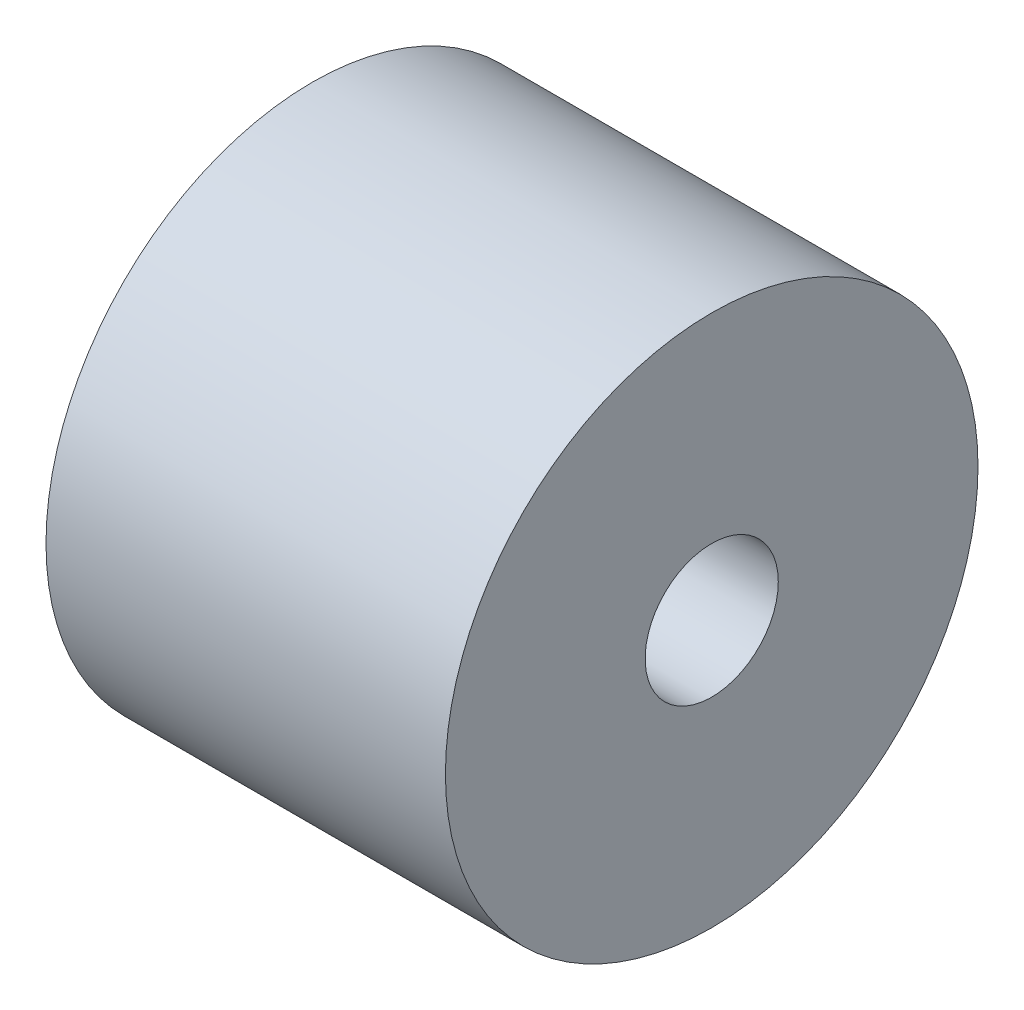
ISO-10303-21;
HEADER;
FILE_DESCRIPTION(('STEP AP214'),'2;1');
FILE_NAME('part.step','',(''),(''),'','','');
FILE_SCHEMA(('AUTOMOTIVE_DESIGN { 1 0 10303 214 1 1 1 1 }'));
ENDSEC;
DATA;
#1=APPLICATION_CONTEXT('core data for automotive mechanical design processes');
#2=APPLICATION_PROTOCOL_DEFINITION('international standard','automotive_design',2000,#1);
#3=PRODUCT_CONTEXT('',#1,'mechanical');
#4=PRODUCT('Part','Part','',(#3));
#5=PRODUCT_RELATED_PRODUCT_CATEGORY('part','',(#4));
#6=PRODUCT_DEFINITION_FORMATION('','',#4);
#7=PRODUCT_DEFINITION_CONTEXT('part definition',#1,'design');
#8=PRODUCT_DEFINITION('design','',#6,#7);
#9=PRODUCT_DEFINITION_SHAPE('','',#8);
#10=(LENGTH_UNIT() NAMED_UNIT(*) SI_UNIT(.MILLI.,.METRE.));
#11=(NAMED_UNIT(*) PLANE_ANGLE_UNIT() SI_UNIT($,.RADIAN.));
#12=(NAMED_UNIT(*) SI_UNIT($,.STERADIAN.) SOLID_ANGLE_UNIT());
#13=UNCERTAINTY_MEASURE_WITH_UNIT(LENGTH_MEASURE(1.E-05),#10,'distance_accuracy_value','');
#14=(GEOMETRIC_REPRESENTATION_CONTEXT(3) GLOBAL_UNCERTAINTY_ASSIGNED_CONTEXT((#13)) GLOBAL_UNIT_ASSIGNED_CONTEXT((#10,
#11,#12)) REPRESENTATION_CONTEXT('',''));
#15=CARTESIAN_POINT('',(0.,0.,0.));
#16=DIRECTION('',(0.,0.,1.));
#17=DIRECTION('',(1.,0.,0.));
#18=AXIS2_PLACEMENT_3D('',#15,#16,#17);
#19=CARTESIAN_POINT('',(3.,0.,0.));
#20=DIRECTION('',(1.,0.,0.));
#21=DIRECTION('',(0.,0.,-1.));
#22=AXIS2_PLACEMENT_3D('',#19,#20,#21);
#23=PLANE('',#22);
#24=CARTESIAN_POINT('',(3.,0.,0.));
#25=DIRECTION('',(1.,0.,0.));
#26=DIRECTION('',(0.,0.,-1.));
#27=AXIS2_PLACEMENT_3D('',#24,#25,#26);
#28=CIRCLE('',#27,2.);
#29=CARTESIAN_POINT('',(3.,0.,-2.));
#30=VERTEX_POINT('',#29);
#31=EDGE_CURVE('E10',#30,#30,#28,.T.);
#32=ORIENTED_EDGE('',*,*,#31,.T.);
#33=EDGE_LOOP('',(#32));
#34=FACE_BOUND('',#33,.T.);
#35=CARTESIAN_POINT('',(3.,0.,0.));
#36=DIRECTION('',(1.,0.,0.));
#37=DIRECTION('',(0.,0.,-1.));
#38=AXIS2_PLACEMENT_3D('',#35,#36,#37);
#39=CIRCLE('',#38,0.5);
#40=CARTESIAN_POINT('',(3.,0.,-0.5));
#41=VERTEX_POINT('',#40);
#42=EDGE_CURVE('E46',#41,#41,#39,.T.);
#43=ORIENTED_EDGE('',*,*,#42,.F.);
#44=EDGE_LOOP('',(#43));
#45=FACE_BOUND('',#44,.T.);
#46=ADVANCED_FACE('F35',(#34,#45),#23,.T.);
#47=CARTESIAN_POINT('',(0.,0.,0.));
#48=DIRECTION('',(1.,0.,0.));
#49=DIRECTION('',(0.,0.,-1.));
#50=AXIS2_PLACEMENT_3D('',#47,#48,#49);
#51=PLANE('',#50);
#52=CARTESIAN_POINT('',(0.,0.,0.));
#53=DIRECTION('',(1.,0.,0.));
#54=DIRECTION('',(0.,0.,-1.));
#55=AXIS2_PLACEMENT_3D('',#52,#53,#54);
#56=CIRCLE('',#55,2.);
#57=CARTESIAN_POINT('',(0.,0.,-2.));
#58=VERTEX_POINT('',#57);
#59=EDGE_CURVE('E39',#58,#58,#56,.T.);
#60=ORIENTED_EDGE('',*,*,#59,.F.);
#61=EDGE_LOOP('',(#60));
#62=FACE_BOUND('',#61,.T.);
#63=CARTESIAN_POINT('',(0.,0.,0.));
#64=DIRECTION('',(1.,0.,0.));
#65=DIRECTION('',(0.,0.,-1.));
#66=AXIS2_PLACEMENT_3D('',#63,#64,#65);
#67=CIRCLE('',#66,0.5);
#68=CARTESIAN_POINT('',(0.,0.,-0.5));
#69=VERTEX_POINT('',#68);
#70=EDGE_CURVE('E48',#69,#69,#67,.T.);
#71=ORIENTED_EDGE('',*,*,#70,.T.);
#72=EDGE_LOOP('',(#71));
#73=FACE_BOUND('',#72,.T.);
#74=ADVANCED_FACE('F58',(#62,#73),#51,.F.);
#75=CARTESIAN_POINT('',(3.,0.,0.));
#76=DIRECTION('',(-1.,0.,0.));
#77=DIRECTION('',(0.,0.,1.));
#78=AXIS2_PLACEMENT_3D('',#75,#76,#77);
#79=CYLINDRICAL_SURFACE('',#78,2.);
#80=ORIENTED_EDGE('',*,*,#31,.F.);
#81=EDGE_LOOP('',(#80));
#82=FACE_BOUND('',#81,.T.);
#83=ORIENTED_EDGE('',*,*,#59,.T.);
#84=EDGE_LOOP('',(#83));
#85=FACE_BOUND('',#84,.T.);
#86=ADVANCED_FACE('F37',(#82,#85),#79,.T.);
#87=CARTESIAN_POINT('',(3.,0.,0.));
#88=DIRECTION('',(-1.,0.,0.));
#89=DIRECTION('',(0.,0.,1.));
#90=AXIS2_PLACEMENT_3D('',#87,#88,#89);
#91=CYLINDRICAL_SURFACE('',#90,0.5);
#92=ORIENTED_EDGE('',*,*,#42,.T.);
#93=EDGE_LOOP('',(#92));
#94=FACE_BOUND('',#93,.T.);
#95=ORIENTED_EDGE('',*,*,#70,.F.);
#96=EDGE_LOOP('',(#95));
#97=FACE_BOUND('',#96,.T.);
#98=ADVANCED_FACE('F54',(#94,#97),#91,.F.);
#99=CLOSED_SHELL('',(#46,#74,#86,#98));
#100=MANIFOLD_SOLID_BREP('B2',#99);
#101=ADVANCED_BREP_SHAPE_REPRESENTATION('',(#18,#100),#14);
#102=SHAPE_DEFINITION_REPRESENTATION(#9,#101);
ENDSEC;
END-ISO-10303-21;
